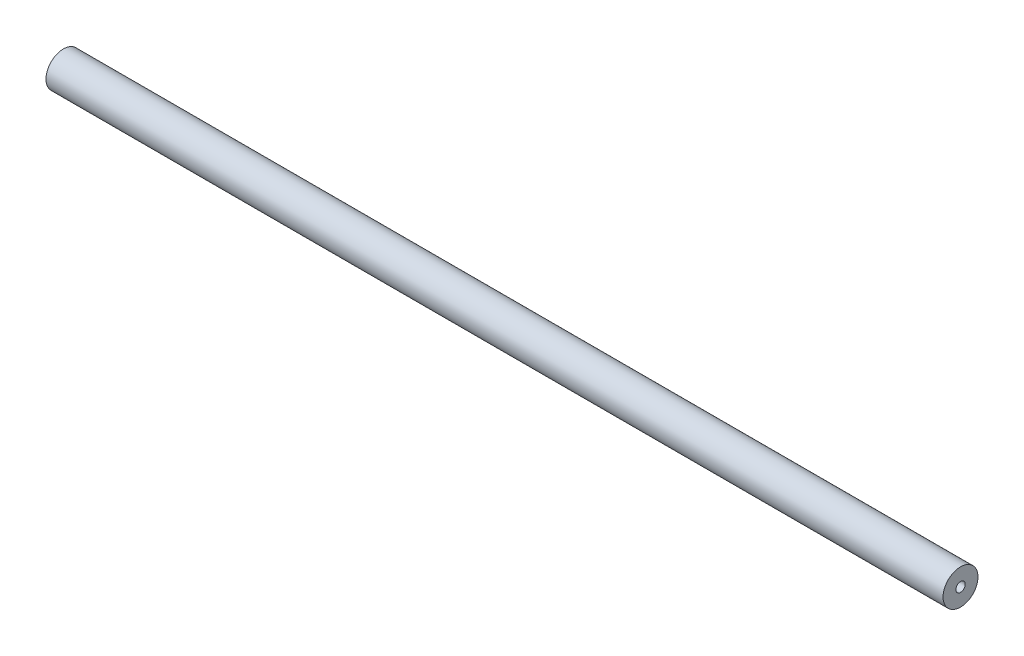
ISO-10303-21;
HEADER;
FILE_DESCRIPTION(('STEP AP214'),'2;1');
FILE_NAME('part.step','',(''),(''),'','','');
FILE_SCHEMA(('AUTOMOTIVE_DESIGN { 1 0 10303 214 1 1 1 1 }'));
ENDSEC;
DATA;
#1=APPLICATION_CONTEXT('core data for automotive mechanical design processes');
#2=APPLICATION_PROTOCOL_DEFINITION('international standard','automotive_design',2000,#1);
#3=PRODUCT_CONTEXT('',#1,'mechanical');
#4=PRODUCT('Part','Part','',(#3));
#5=PRODUCT_RELATED_PRODUCT_CATEGORY('part','',(#4));
#6=PRODUCT_DEFINITION_FORMATION('','',#4);
#7=PRODUCT_DEFINITION_CONTEXT('part definition',#1,'design');
#8=PRODUCT_DEFINITION('design','',#6,#7);
#9=PRODUCT_DEFINITION_SHAPE('','',#8);
#10=(LENGTH_UNIT() NAMED_UNIT(*) SI_UNIT(.MILLI.,.METRE.));
#11=(NAMED_UNIT(*) PLANE_ANGLE_UNIT() SI_UNIT($,.RADIAN.));
#12=(NAMED_UNIT(*) SI_UNIT($,.STERADIAN.) SOLID_ANGLE_UNIT());
#13=UNCERTAINTY_MEASURE_WITH_UNIT(LENGTH_MEASURE(1.E-05),#10,'distance_accuracy_value','');
#14=(GEOMETRIC_REPRESENTATION_CONTEXT(3) GLOBAL_UNCERTAINTY_ASSIGNED_CONTEXT((#13)) GLOBAL_UNIT_ASSIGNED_CONTEXT((#10,
#11,#12)) REPRESENTATION_CONTEXT('',''));
#15=CARTESIAN_POINT('',(0.,0.,0.));
#16=DIRECTION('',(0.,0.,1.));
#17=DIRECTION('',(1.,0.,0.));
#18=AXIS2_PLACEMENT_3D('',#15,#16,#17);
#19=CARTESIAN_POINT('',(-488.95,0.,0.));
#20=DIRECTION('',(1.,0.,0.));
#21=DIRECTION('',(0.,0.,-1.));
#22=AXIS2_PLACEMENT_3D('',#19,#20,#21);
#23=CYLINDRICAL_SURFACE('',#22,9.525);
#24=CARTESIAN_POINT('',(-488.95,0.,0.));
#25=DIRECTION('',(1.,0.,0.));
#26=DIRECTION('',(0.,0.,-1.));
#27=AXIS2_PLACEMENT_3D('',#24,#25,#26);
#28=CIRCLE('',#27,9.525);
#29=CARTESIAN_POINT('',(-488.95,0.,-9.525));
#30=VERTEX_POINT('',#29);
#31=EDGE_CURVE('E13',#30,#30,#28,.T.);
#32=ORIENTED_EDGE('',*,*,#31,.T.);
#33=EDGE_LOOP('',(#32));
#34=FACE_BOUND('',#33,.T.);
#35=CARTESIAN_POINT('',(0.,0.,0.));
#36=DIRECTION('',(1.,0.,0.));
#37=DIRECTION('',(0.,0.,-1.));
#38=AXIS2_PLACEMENT_3D('',#35,#36,#37);
#39=CIRCLE('',#38,9.525);
#40=CARTESIAN_POINT('',(0.,0.,-9.525));
#41=VERTEX_POINT('',#40);
#42=EDGE_CURVE('E55',#41,#41,#39,.T.);
#43=ORIENTED_EDGE('',*,*,#42,.F.);
#44=EDGE_LOOP('',(#43));
#45=FACE_BOUND('',#44,.T.);
#46=ADVANCED_FACE('F52',(#34,#45),#23,.T.);
#47=CARTESIAN_POINT('',(-488.95,0.,0.));
#48=DIRECTION('',(1.,0.,0.));
#49=DIRECTION('',(0.,0.,-1.));
#50=AXIS2_PLACEMENT_3D('',#47,#48,#49);
#51=PLANE('',#50);
#52=CARTESIAN_POINT('',(-488.95,0.,0.));
#53=DIRECTION('',(-1.,0.,0.));
#54=DIRECTION('',(0.,0.,1.));
#55=AXIS2_PLACEMENT_3D('',#52,#53,#54);
#56=CIRCLE('',#55,2.55269999999999);
#57=CARTESIAN_POINT('',(-488.95,0.,2.55269999999999));
#58=VERTEX_POINT('',#57);
#59=EDGE_CURVE('E78',#58,#58,#56,.T.);
#60=ORIENTED_EDGE('',*,*,#59,.F.);
#61=EDGE_LOOP('',(#60));
#62=FACE_BOUND('',#61,.T.);
#63=ORIENTED_EDGE('',*,*,#31,.F.);
#64=EDGE_LOOP('',(#63));
#65=FACE_BOUND('',#64,.T.);
#66=ADVANCED_FACE('F102',(#62,#65),#51,.F.);
#67=CARTESIAN_POINT('',(0.,0.,0.));
#68=DIRECTION('',(1.,0.,0.));
#69=DIRECTION('',(0.,0.,-1.));
#70=AXIS2_PLACEMENT_3D('',#67,#68,#69);
#71=PLANE('',#70);
#72=CARTESIAN_POINT('',(0.,0.,0.));
#73=DIRECTION('',(1.,0.,0.));
#74=DIRECTION('',(0.,0.,-1.));
#75=AXIS2_PLACEMENT_3D('',#72,#73,#74);
#76=CIRCLE('',#75,2.55269999999999);
#77=CARTESIAN_POINT('',(0.,0.,-2.55269999999999));
#78=VERTEX_POINT('',#77);
#79=EDGE_CURVE('E77',#78,#78,#76,.T.);
#80=ORIENTED_EDGE('',*,*,#79,.F.);
#81=EDGE_LOOP('',(#80));
#82=FACE_BOUND('',#81,.T.);
#83=ORIENTED_EDGE('',*,*,#42,.T.);
#84=EDGE_LOOP('',(#83));
#85=FACE_BOUND('',#84,.T.);
#86=ADVANCED_FACE('F99',(#82,#85),#71,.T.);
#87=CARTESIAN_POINT('',(-16.51,0.,0.));
#88=DIRECTION('',(1.,0.,0.));
#89=DIRECTION('',(0.,0.,-1.));
#90=AXIS2_PLACEMENT_3D('',#87,#88,#89);
#91=CONICAL_SURFACE('',#90,2.55269999999999,1.02974425867665);
#92=CARTESIAN_POINT('',(-18.0438169021916,0.,0.));
#93=VERTEX_POINT('',#92);
#94=VERTEX_LOOP('',#93);
#95=FACE_BOUND('',#94,.T.);
#96=CARTESIAN_POINT('',(-16.51,0.,0.));
#97=DIRECTION('',(1.,0.,0.));
#98=DIRECTION('',(0.,0.,-1.));
#99=AXIS2_PLACEMENT_3D('',#96,#97,#98);
#100=CIRCLE('',#99,2.55269999999999);
#101=CARTESIAN_POINT('',(-16.51,0.,-2.55269999999999));
#102=VERTEX_POINT('',#101);
#103=EDGE_CURVE('E84',#102,#102,#100,.T.);
#104=ORIENTED_EDGE('',*,*,#103,.T.);
#105=EDGE_LOOP('',(#104));
#106=FACE_BOUND('',#105,.T.);
#107=ADVANCED_FACE('F114',(#95,#106),#91,.F.);
#108=CARTESIAN_POINT('',(0.,0.,0.));
#109=DIRECTION('',(1.,0.,0.));
#110=DIRECTION('',(0.,0.,-1.));
#111=AXIS2_PLACEMENT_3D('',#108,#109,#110);
#112=CYLINDRICAL_SURFACE('',#111,2.55269999999999);
#113=ORIENTED_EDGE('',*,*,#103,.F.);
#114=EDGE_LOOP('',(#113));
#115=FACE_BOUND('',#114,.T.);
#116=ORIENTED_EDGE('',*,*,#79,.T.);
#117=EDGE_LOOP('',(#116));
#118=FACE_BOUND('',#117,.T.);
#119=ADVANCED_FACE('F70',(#115,#118),#112,.F.);
#120=CARTESIAN_POINT('',(-472.44,0.,0.));
#121=DIRECTION('',(-1.,0.,0.));
#122=DIRECTION('',(0.,0.,1.));
#123=AXIS2_PLACEMENT_3D('',#120,#121,#122);
#124=CONICAL_SURFACE('',#123,2.55269999999999,1.02974425867666);
#125=CARTESIAN_POINT('',(-470.906183097808,0.,0.));
#126=VERTEX_POINT('',#125);
#127=VERTEX_LOOP('',#126);
#128=FACE_BOUND('',#127,.T.);
#129=CARTESIAN_POINT('',(-472.44,0.,0.));
#130=DIRECTION('',(-1.,0.,0.));
#131=DIRECTION('',(0.,0.,1.));
#132=AXIS2_PLACEMENT_3D('',#129,#130,#131);
#133=CIRCLE('',#132,2.55269999999999);
#134=CARTESIAN_POINT('',(-472.44,0.,2.55269999999999));
#135=VERTEX_POINT('',#134);
#136=EDGE_CURVE('E74',#135,#135,#133,.T.);
#137=ORIENTED_EDGE('',*,*,#136,.T.);
#138=EDGE_LOOP('',(#137));
#139=FACE_BOUND('',#138,.T.);
#140=ADVANCED_FACE('F66',(#128,#139),#124,.F.);
#141=CARTESIAN_POINT('',(-488.95,0.,0.));
#142=DIRECTION('',(-1.,0.,0.));
#143=DIRECTION('',(0.,0.,1.));
#144=AXIS2_PLACEMENT_3D('',#141,#142,#143);
#145=CYLINDRICAL_SURFACE('',#144,2.55269999999999);
#146=ORIENTED_EDGE('',*,*,#136,.F.);
#147=EDGE_LOOP('',(#146));
#148=FACE_BOUND('',#147,.T.);
#149=ORIENTED_EDGE('',*,*,#59,.T.);
#150=EDGE_LOOP('',(#149));
#151=FACE_BOUND('',#150,.T.);
#152=ADVANCED_FACE('F69',(#148,#151),#145,.F.);
#153=CLOSED_SHELL('',(#46,#66,#86,#107,#119,#140,#152));
#154=MANIFOLD_SOLID_BREP('B2',#153);
#155=ADVANCED_BREP_SHAPE_REPRESENTATION('',(#18,#154),#14);
#156=SHAPE_DEFINITION_REPRESENTATION(#9,#155);
ENDSEC;
END-ISO-10303-21;
